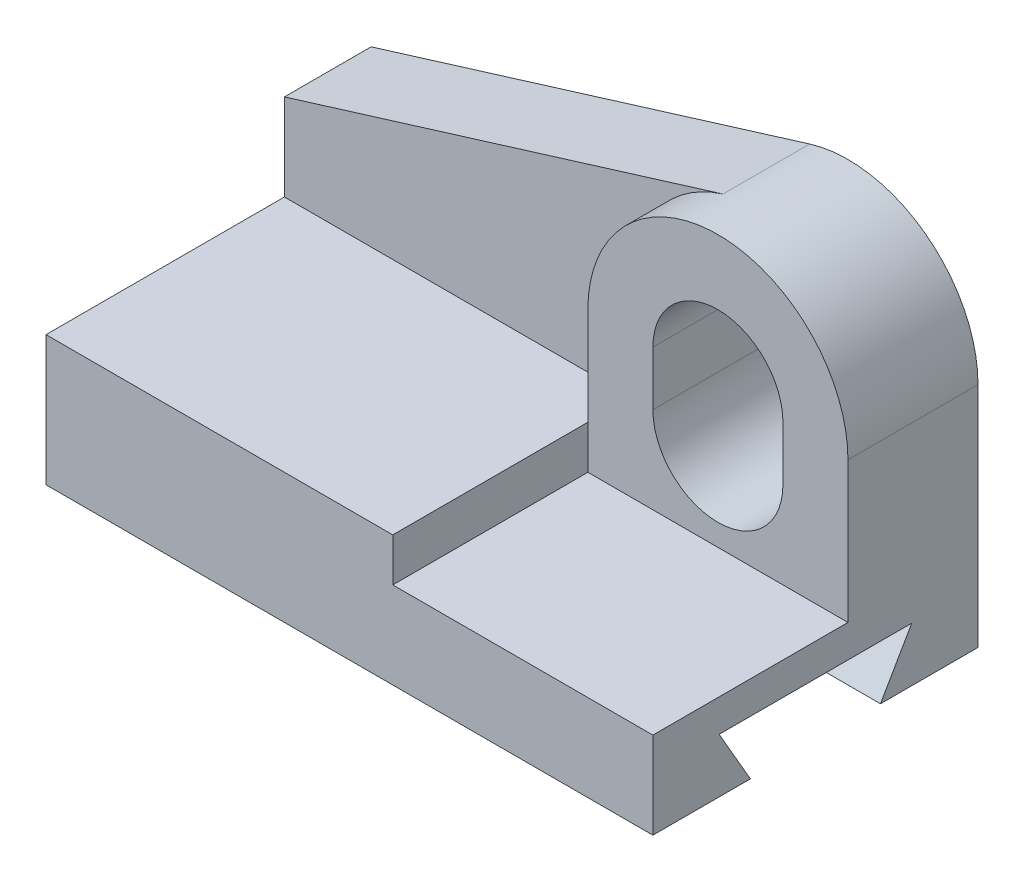
ISO-10303-21;
HEADER;
FILE_DESCRIPTION(('STEP AP214'),'2;1');
FILE_NAME('part.step','',(''),(''),'','','');
FILE_SCHEMA(('AUTOMOTIVE_DESIGN { 1 0 10303 214 1 1 1 1 }'));
ENDSEC;
DATA;
#1=APPLICATION_CONTEXT('core data for automotive mechanical design processes');
#2=APPLICATION_PROTOCOL_DEFINITION('international standard','automotive_design',2000,#1);
#3=PRODUCT_CONTEXT('',#1,'mechanical');
#4=PRODUCT('Part','Part','',(#3));
#5=PRODUCT_RELATED_PRODUCT_CATEGORY('part','',(#4));
#6=PRODUCT_DEFINITION_FORMATION('','',#4);
#7=PRODUCT_DEFINITION_CONTEXT('part definition',#1,'design');
#8=PRODUCT_DEFINITION('design','',#6,#7);
#9=PRODUCT_DEFINITION_SHAPE('','',#8);
#10=(LENGTH_UNIT() NAMED_UNIT(*) SI_UNIT(.MILLI.,.METRE.));
#11=(NAMED_UNIT(*) PLANE_ANGLE_UNIT() SI_UNIT($,.RADIAN.));
#12=(NAMED_UNIT(*) SI_UNIT($,.STERADIAN.) SOLID_ANGLE_UNIT());
#13=UNCERTAINTY_MEASURE_WITH_UNIT(LENGTH_MEASURE(1.E-05),#10,'distance_accuracy_value','');
#14=(GEOMETRIC_REPRESENTATION_CONTEXT(3) GLOBAL_UNCERTAINTY_ASSIGNED_CONTEXT((#13)) GLOBAL_UNIT_ASSIGNED_CONTEXT((#10,
#11,#12)) REPRESENTATION_CONTEXT('',''));
#15=CARTESIAN_POINT('',(0.,0.,0.));
#16=DIRECTION('',(0.,0.,1.));
#17=DIRECTION('',(1.,0.,0.));
#18=AXIS2_PLACEMENT_3D('',#15,#16,#17);
#19=CARTESIAN_POINT('',(16.,21.,-3.));
#20=DIRECTION('',(0.,0.,-1.));
#21=DIRECTION('',(-1.,0.,0.));
#22=AXIS2_PLACEMENT_3D('',#19,#20,#21);
#23=CYLINDRICAL_SURFACE('',#22,12.);
#24=DIRECTION('',(0.,0.,-1.));
#25=VECTOR('',#24,1.);
#26=CARTESIAN_POINT('',(12.466636051299,32.4680137428423,-7.));
#27=LINE('',#26,#25);
#28=CARTESIAN_POINT('',(12.466636051299,32.4680137428423,-7.));
#29=VERTEX_POINT('',#28);
#30=CARTESIAN_POINT('',(12.466636051299,32.4680137428423,-15.));
#31=VERTEX_POINT('',#30);
#32=EDGE_CURVE('E64',#29,#31,#27,.T.);
#33=ORIENTED_EDGE('',*,*,#32,.F.);
#34=CARTESIAN_POINT('',(16.,21.,-7.));
#35=DIRECTION('',(0.,0.,-1.));
#36=DIRECTION('',(1.,0.,0.));
#37=AXIS2_PLACEMENT_3D('',#34,#35,#36);
#38=CIRCLE('',#37,12.);
#39=CARTESIAN_POINT('',(4.,21.,-7.));
#40=VERTEX_POINT('',#39);
#41=EDGE_CURVE('E176',#40,#29,#38,.T.);
#42=ORIENTED_EDGE('',*,*,#41,.F.);
#43=DIRECTION('',(0.,0.,-1.));
#44=VECTOR('',#43,1.);
#45=CARTESIAN_POINT('',(4.,21.,-3.));
#46=LINE('',#45,#44);
#47=CARTESIAN_POINT('',(4.,21.,-3.));
#48=VERTEX_POINT('',#47);
#49=EDGE_CURVE('E240',#48,#40,#46,.T.);
#50=ORIENTED_EDGE('',*,*,#49,.F.);
#51=CARTESIAN_POINT('',(16.,21.,-3.));
#52=DIRECTION('',(0.,0.,1.));
#53=DIRECTION('',(-1.,0.,0.));
#54=AXIS2_PLACEMENT_3D('',#51,#52,#53);
#55=CIRCLE('',#54,12.);
#56=CARTESIAN_POINT('',(28.,21.,-3.));
#57=VERTEX_POINT('',#56);
#58=EDGE_CURVE('E234',#57,#48,#55,.T.);
#59=ORIENTED_EDGE('',*,*,#58,.F.);
#60=DIRECTION('',(0.,0.,-1.));
#61=VECTOR('',#60,1.);
#62=CARTESIAN_POINT('',(28.,21.,-3.));
#63=LINE('',#62,#61);
#64=CARTESIAN_POINT('',(28.,21.,-15.));
#65=VERTEX_POINT('',#64);
#66=EDGE_CURVE('E244',#57,#65,#63,.T.);
#67=ORIENTED_EDGE('',*,*,#66,.T.);
#68=CARTESIAN_POINT('',(16.,21.,-15.));
#69=DIRECTION('',(0.,0.,1.));
#70=DIRECTION('',(-1.,0.,0.));
#71=AXIS2_PLACEMENT_3D('',#68,#69,#70);
#72=CIRCLE('',#71,12.);
#73=EDGE_CURVE('E228',#65,#31,#72,.T.);
#74=ORIENTED_EDGE('',*,*,#73,.T.);
#75=EDGE_LOOP('',(#33,#42,#50,#59,#67,#74));
#76=FACE_BOUND('',#75,.T.);
#77=ADVANCED_FACE('F41',(#76),#23,.T.);
#78=CARTESIAN_POINT('',(0.,8.,0.));
#79=DIRECTION('',(0.,-1.,0.));
#80=DIRECTION('',(0.,0.,-1.));
#81=AXIS2_PLACEMENT_3D('',#78,#79,#80);
#82=PLANE('',#81);
#83=DIRECTION('',(1.,0.,0.));
#84=VECTOR('',#83,1.);
#85=CARTESIAN_POINT('',(4.,8.,-3.));
#86=LINE('',#85,#84);
#87=CARTESIAN_POINT('',(4.,8.,-3.));
#88=VERTEX_POINT('',#87);
#89=CARTESIAN_POINT('',(28.,8.,-3.));
#90=VERTEX_POINT('',#89);
#91=EDGE_CURVE('E229',#88,#90,#86,.T.);
#92=ORIENTED_EDGE('',*,*,#91,.F.);
#93=DIRECTION('',(0.,0.,-1.));
#94=VECTOR('',#93,1.);
#95=CARTESIAN_POINT('',(4.,8.,15.));
#96=LINE('',#95,#94);
#97=CARTESIAN_POINT('',(4.,8.,15.));
#98=VERTEX_POINT('',#97);
#99=EDGE_CURVE('E267',#98,#88,#96,.T.);
#100=ORIENTED_EDGE('',*,*,#99,.F.);
#101=DIRECTION('',(1.,0.,0.));
#102=VECTOR('',#101,1.);
#103=CARTESIAN_POINT('',(-28.,8.,15.));
#104=LINE('',#103,#102);
#105=CARTESIAN_POINT('',(28.,8.,15.));
#106=VERTEX_POINT('',#105);
#107=EDGE_CURVE('E290',#98,#106,#104,.T.);
#108=ORIENTED_EDGE('',*,*,#107,.T.);
#109=DIRECTION('',(0.,0.,-1.));
#110=VECTOR('',#109,1.);
#111=CARTESIAN_POINT('',(28.,8.,15.));
#112=LINE('',#111,#110);
#113=EDGE_CURVE('E287',#106,#90,#112,.T.);
#114=ORIENTED_EDGE('',*,*,#113,.T.);
#115=EDGE_LOOP('',(#92,#100,#108,#114));
#116=FACE_BOUND('',#115,.T.);
#117=ADVANCED_FACE('F339',(#116),#82,.F.);
#118=CARTESIAN_POINT('',(4.,12.,15.));
#119=DIRECTION('',(-1.,0.,0.));
#120=DIRECTION('',(0.,0.,1.));
#121=AXIS2_PLACEMENT_3D('',#118,#119,#120);
#122=PLANE('',#121);
#123=DIRECTION('',(0.,-1.,0.));
#124=VECTOR('',#123,1.);
#125=CARTESIAN_POINT('',(4.,8.,-3.));
#126=LINE('',#125,#124);
#127=CARTESIAN_POINT('',(4.,12.,-3.));
#128=VERTEX_POINT('',#127);
#129=EDGE_CURVE('E236',#128,#88,#126,.T.);
#130=ORIENTED_EDGE('',*,*,#129,.F.);
#131=DIRECTION('',(0.,0.,-1.));
#132=VECTOR('',#131,1.);
#133=CARTESIAN_POINT('',(4.,12.,15.));
#134=LINE('',#133,#132);
#135=CARTESIAN_POINT('',(4.,12.,15.));
#136=VERTEX_POINT('',#135);
#137=EDGE_CURVE('E278',#136,#128,#134,.T.);
#138=ORIENTED_EDGE('',*,*,#137,.F.);
#139=DIRECTION('',(0.,-1.,0.));
#140=VECTOR('',#139,1.);
#141=CARTESIAN_POINT('',(4.,12.,15.));
#142=LINE('',#141,#140);
#143=EDGE_CURVE('E281',#136,#98,#142,.T.);
#144=ORIENTED_EDGE('',*,*,#143,.T.);
#145=ORIENTED_EDGE('',*,*,#99,.T.);
#146=EDGE_LOOP('',(#130,#138,#144,#145));
#147=FACE_BOUND('',#146,.T.);
#148=ADVANCED_FACE('F344',(#147),#122,.F.);
#149=CARTESIAN_POINT('',(0.,0.,0.));
#150=DIRECTION('',(0.,-1.,0.));
#151=DIRECTION('',(0.,0.,-1.));
#152=AXIS2_PLACEMENT_3D('',#149,#150,#151);
#153=PLANE('',#152);
#154=DIRECTION('',(-1.,0.,0.));
#155=VECTOR('',#154,1.);
#156=CARTESIAN_POINT('',(28.,0.,-6.));
#157=LINE('',#156,#155);
#158=CARTESIAN_POINT('',(28.,0.,-6.));
#159=VERTEX_POINT('',#158);
#160=CARTESIAN_POINT('',(-28.,0.,-6.));
#161=VERTEX_POINT('',#160);
#162=EDGE_CURVE('E258',#159,#161,#157,.T.);
#163=ORIENTED_EDGE('',*,*,#162,.T.);
#164=DIRECTION('',(0.,0.,1.));
#165=VECTOR('',#164,1.);
#166=CARTESIAN_POINT('',(-28.,0.,15.));
#167=LINE('',#166,#165);
#168=CARTESIAN_POINT('',(-28.,0.,-15.));
#169=VERTEX_POINT('',#168);
#170=EDGE_CURVE('E300',#169,#161,#167,.T.);
#171=ORIENTED_EDGE('',*,*,#170,.F.);
#172=DIRECTION('',(-1.,0.,0.));
#173=VECTOR('',#172,1.);
#174=CARTESIAN_POINT('',(-28.,0.,-15.));
#175=LINE('',#174,#173);
#176=CARTESIAN_POINT('',(28.,0.,-15.));
#177=VERTEX_POINT('',#176);
#178=EDGE_CURVE('E297',#177,#169,#175,.T.);
#179=ORIENTED_EDGE('',*,*,#178,.F.);
#180=DIRECTION('',(0.,0.,-1.));
#181=VECTOR('',#180,1.);
#182=CARTESIAN_POINT('',(28.,0.,15.));
#183=LINE('',#182,#181);
#184=EDGE_CURVE('E286',#159,#177,#183,.T.);
#185=ORIENTED_EDGE('',*,*,#184,.F.);
#186=EDGE_LOOP('',(#163,#171,#179,#185));
#187=FACE_BOUND('',#186,.T.);
#188=ADVANCED_FACE('F312',(#187),#153,.T.);
#189=CARTESIAN_POINT('',(28.,8.,15.));
#190=DIRECTION('',(-1.,0.,0.));
#191=DIRECTION('',(0.,0.,1.));
#192=AXIS2_PLACEMENT_3D('',#189,#190,#191);
#193=PLANE('',#192);
#194=DIRECTION('',(0.,0.,-1.));
#195=VECTOR('',#194,1.);
#196=CARTESIAN_POINT('',(28.,5.,8.88675134594816));
#197=LINE('',#196,#195);
#198=CARTESIAN_POINT('',(28.,5.,8.88675134594816));
#199=VERTEX_POINT('',#198);
#200=CARTESIAN_POINT('',(28.,5.,-8.88675134594816));
#201=VERTEX_POINT('',#200);
#202=EDGE_CURVE('E255',#199,#201,#197,.T.);
#203=ORIENTED_EDGE('',*,*,#202,.T.);
#204=DIRECTION('',(0.,-0.866025403784436,0.500000000000004));
#205=VECTOR('',#204,1.);
#206=CARTESIAN_POINT('',(28.,5.,-8.88675134594816));
#207=LINE('',#206,#205);
#208=EDGE_CURVE('E248',#201,#159,#207,.T.);
#209=ORIENTED_EDGE('',*,*,#208,.T.);
#210=ORIENTED_EDGE('',*,*,#184,.T.);
#211=DIRECTION('',(0.,-1.,0.));
#212=VECTOR('',#211,1.);
#213=CARTESIAN_POINT('',(28.,8.,-15.));
#214=LINE('',#213,#212);
#215=EDGE_CURVE('E11',#65,#177,#214,.T.);
#216=ORIENTED_EDGE('',*,*,#215,.F.);
#217=ORIENTED_EDGE('',*,*,#66,.F.);
#218=DIRECTION('',(0.,1.,0.));
#219=VECTOR('',#218,1.);
#220=CARTESIAN_POINT('',(28.,8.,-3.));
#221=LINE('',#220,#219);
#222=EDGE_CURVE('E232',#90,#57,#221,.T.);
#223=ORIENTED_EDGE('',*,*,#222,.F.);
#224=ORIENTED_EDGE('',*,*,#113,.F.);
#225=DIRECTION('',(0.,-1.,0.));
#226=VECTOR('',#225,1.);
#227=CARTESIAN_POINT('',(28.,8.,15.));
#228=LINE('',#227,#226);
#229=CARTESIAN_POINT('',(28.,0.,15.));
#230=VERTEX_POINT('',#229);
#231=EDGE_CURVE('E293',#106,#230,#228,.T.);
#232=ORIENTED_EDGE('',*,*,#231,.T.);
#233=CARTESIAN_POINT('',(28.,0.,6.));
#234=VERTEX_POINT('',#233);
#235=EDGE_CURVE('E294',#230,#234,#183,.T.);
#236=ORIENTED_EDGE('',*,*,#235,.T.);
#237=DIRECTION('',(0.,0.866025403784436,0.500000000000004));
#238=VECTOR('',#237,1.);
#239=CARTESIAN_POINT('',(28.,0.,6.));
#240=LINE('',#239,#238);
#241=EDGE_CURVE('E251',#234,#199,#240,.T.);
#242=ORIENTED_EDGE('',*,*,#241,.T.);
#243=EDGE_LOOP('',(#203,#209,#210,#216,#217,#223,#224,#232,#236,#242));
#244=FACE_BOUND('',#243,.T.);
#245=ADVANCED_FACE('F43',(#244),#193,.F.);
#246=CARTESIAN_POINT('',(-28.,8.,-15.));
#247=DIRECTION('',(0.,0.,1.));
#248=DIRECTION('',(1.,0.,0.));
#249=AXIS2_PLACEMENT_3D('',#246,#247,#248);
#250=PLANE('',#249);
#251=DIRECTION('',(0.,-1.,0.));
#252=VECTOR('',#251,1.);
#253=CARTESIAN_POINT('',(-28.,8.,-15.));
#254=LINE('',#253,#252);
#255=CARTESIAN_POINT('',(-28.,20.,-15.));
#256=VERTEX_POINT('',#255);
#257=EDGE_CURVE('E49',#256,#169,#254,.T.);
#258=ORIENTED_EDGE('',*,*,#257,.F.);
#259=DIRECTION('',(-0.955667811903527,-0.29444699572508,0.));
#260=VECTOR('',#259,1.);
#261=CARTESIAN_POINT('',(-28.,20.,-15.));
#262=LINE('',#261,#260);
#263=EDGE_CURVE('E184',#31,#256,#262,.T.);
#264=ORIENTED_EDGE('',*,*,#263,.F.);
#265=ORIENTED_EDGE('',*,*,#73,.F.);
#266=ORIENTED_EDGE('',*,*,#215,.T.);
#267=ORIENTED_EDGE('',*,*,#178,.T.);
#268=EDGE_LOOP('',(#258,#264,#265,#266,#267));
#269=FACE_BOUND('',#268,.T.);
#270=DIRECTION('',(0.,1.,0.));
#271=VECTOR('',#270,1.);
#272=CARTESIAN_POINT('',(22.,21.,-15.));
#273=LINE('',#272,#271);
#274=CARTESIAN_POINT('',(22.,16.,-15.));
#275=VERTEX_POINT('',#274);
#276=CARTESIAN_POINT('',(22.,21.,-15.));
#277=VERTEX_POINT('',#276);
#278=EDGE_CURVE('E201',#275,#277,#273,.T.);
#279=ORIENTED_EDGE('',*,*,#278,.T.);
#280=CARTESIAN_POINT('',(16.,21.,-15.));
#281=DIRECTION('',(0.,0.,1.));
#282=DIRECTION('',(-1.,0.,0.));
#283=AXIS2_PLACEMENT_3D('',#280,#281,#282);
#284=CIRCLE('',#283,6.00000000000001);
#285=CARTESIAN_POINT('',(9.99999999999999,21.,-15.));
#286=VERTEX_POINT('',#285);
#287=EDGE_CURVE('E197',#277,#286,#284,.T.);
#288=ORIENTED_EDGE('',*,*,#287,.T.);
#289=DIRECTION('',(0.,-1.,0.));
#290=VECTOR('',#289,1.);
#291=CARTESIAN_POINT('',(9.99999999999999,21.,-15.));
#292=LINE('',#291,#290);
#293=CARTESIAN_POINT('',(10.,16.,-15.));
#294=VERTEX_POINT('',#293);
#295=EDGE_CURVE('E211',#286,#294,#292,.T.);
#296=ORIENTED_EDGE('',*,*,#295,.T.);
#297=CARTESIAN_POINT('',(16.,16.,-15.));
#298=DIRECTION('',(0.,0.,1.));
#299=DIRECTION('',(1.,0.,0.));
#300=AXIS2_PLACEMENT_3D('',#297,#298,#299);
#301=CIRCLE('',#300,6.);
#302=EDGE_CURVE('E214',#294,#275,#301,.T.);
#303=ORIENTED_EDGE('',*,*,#302,.T.);
#304=EDGE_LOOP('',(#279,#288,#296,#303));
#305=FACE_BOUND('',#304,.T.);
#306=ADVANCED_FACE('F358',(#269,#305),#250,.F.);
#307=CARTESIAN_POINT('',(-28.,8.,15.));
#308=DIRECTION('',(1.,0.,0.));
#309=DIRECTION('',(0.,0.,-1.));
#310=AXIS2_PLACEMENT_3D('',#307,#308,#309);
#311=PLANE('',#310);
#312=ORIENTED_EDGE('',*,*,#170,.T.);
#313=DIRECTION('',(0.,-0.866025403784436,0.500000000000004));
#314=VECTOR('',#313,1.);
#315=CARTESIAN_POINT('',(-28.,5.,-8.88675134594816));
#316=LINE('',#315,#314);
#317=CARTESIAN_POINT('',(-28.,5.,-8.88675134594816));
#318=VERTEX_POINT('',#317);
#319=EDGE_CURVE('E247',#318,#161,#316,.T.);
#320=ORIENTED_EDGE('',*,*,#319,.F.);
#321=DIRECTION('',(0.,0.,-1.));
#322=VECTOR('',#321,1.);
#323=CARTESIAN_POINT('',(-28.,5.,8.88675134594816));
#324=LINE('',#323,#322);
#325=CARTESIAN_POINT('',(-28.,5.,8.88675134594816));
#326=VERTEX_POINT('',#325);
#327=EDGE_CURVE('E252',#326,#318,#324,.T.);
#328=ORIENTED_EDGE('',*,*,#327,.F.);
#329=DIRECTION('',(0.,0.866025403784436,0.500000000000004));
#330=VECTOR('',#329,1.);
#331=CARTESIAN_POINT('',(-28.,0.,6.));
#332=LINE('',#331,#330);
#333=CARTESIAN_POINT('',(-28.,0.,6.));
#334=VERTEX_POINT('',#333);
#335=EDGE_CURVE('E260',#334,#326,#332,.T.);
#336=ORIENTED_EDGE('',*,*,#335,.F.);
#337=CARTESIAN_POINT('',(-28.,0.,15.));
#338=VERTEX_POINT('',#337);
#339=EDGE_CURVE('E299',#334,#338,#167,.T.);
#340=ORIENTED_EDGE('',*,*,#339,.T.);
#341=DIRECTION('',(0.,-1.,0.));
#342=VECTOR('',#341,1.);
#343=CARTESIAN_POINT('',(-28.,8.,15.));
#344=LINE('',#343,#342);
#345=CARTESIAN_POINT('',(-28.,12.,15.));
#346=VERTEX_POINT('',#345);
#347=EDGE_CURVE('E305',#346,#338,#344,.T.);
#348=ORIENTED_EDGE('',*,*,#347,.F.);
#349=DIRECTION('',(0.,0.,1.));
#350=VECTOR('',#349,1.);
#351=CARTESIAN_POINT('',(-28.,12.,-15.));
#352=LINE('',#351,#350);
#353=CARTESIAN_POINT('',(-28.,12.,-7.));
#354=VERTEX_POINT('',#353);
#355=EDGE_CURVE('E191',#354,#346,#352,.T.);
#356=ORIENTED_EDGE('',*,*,#355,.F.);
#357=DIRECTION('',(0.,-1.,0.));
#358=VECTOR('',#357,1.);
#359=CARTESIAN_POINT('',(-28.,12.,-7.));
#360=LINE('',#359,#358);
#361=CARTESIAN_POINT('',(-28.,20.,-7.));
#362=VERTEX_POINT('',#361);
#363=EDGE_CURVE('E174',#362,#354,#360,.T.);
#364=ORIENTED_EDGE('',*,*,#363,.F.);
#365=DIRECTION('',(0.,0.,-1.));
#366=VECTOR('',#365,1.);
#367=CARTESIAN_POINT('',(-28.,20.,-7.));
#368=LINE('',#367,#366);
#369=EDGE_CURVE('E181',#362,#256,#368,.T.);
#370=ORIENTED_EDGE('',*,*,#369,.T.);
#371=ORIENTED_EDGE('',*,*,#257,.T.);
#372=EDGE_LOOP('',(#312,#320,#328,#336,#340,#348,#356,#364,#370,#371));
#373=FACE_BOUND('',#372,.T.);
#374=ADVANCED_FACE('F189',(#373),#311,.F.);
#375=CARTESIAN_POINT('',(-28.,8.,15.));
#376=DIRECTION('',(0.,0.,-1.));
#377=DIRECTION('',(-1.,0.,0.));
#378=AXIS2_PLACEMENT_3D('',#375,#376,#377);
#379=PLANE('',#378);
#380=DIRECTION('',(1.,0.,0.));
#381=VECTOR('',#380,1.);
#382=CARTESIAN_POINT('',(-28.,0.,15.));
#383=LINE('',#382,#381);
#384=EDGE_CURVE('E291',#338,#230,#383,.T.);
#385=ORIENTED_EDGE('',*,*,#384,.T.);
#386=ORIENTED_EDGE('',*,*,#231,.F.);
#387=ORIENTED_EDGE('',*,*,#107,.F.);
#388=ORIENTED_EDGE('',*,*,#143,.F.);
#389=DIRECTION('',(1.,0.,0.));
#390=VECTOR('',#389,1.);
#391=CARTESIAN_POINT('',(-28.,12.,15.));
#392=LINE('',#391,#390);
#393=EDGE_CURVE('E275',#346,#136,#392,.T.);
#394=ORIENTED_EDGE('',*,*,#393,.F.);
#395=ORIENTED_EDGE('',*,*,#347,.T.);
#396=EDGE_LOOP('',(#385,#386,#387,#388,#394,#395));
#397=FACE_BOUND('',#396,.T.);
#398=ADVANCED_FACE('F332',(#397),#379,.F.);
#399=DIRECTION('',(-1.,0.,0.));
#400=VECTOR('',#399,1.);
#401=CARTESIAN_POINT('',(28.,0.,6.));
#402=LINE('',#401,#400);
#403=EDGE_CURVE('E270',#234,#334,#402,.T.);
#404=ORIENTED_EDGE('',*,*,#403,.F.);
#405=ORIENTED_EDGE('',*,*,#235,.F.);
#406=ORIENTED_EDGE('',*,*,#384,.F.);
#407=ORIENTED_EDGE('',*,*,#339,.F.);
#408=EDGE_LOOP('',(#404,#405,#406,#407));
#409=FACE_BOUND('',#408,.T.);
#410=ADVANCED_FACE('F328',(#409),#153,.T.);
#411=CARTESIAN_POINT('',(0.,12.,0.));
#412=DIRECTION('',(0.,1.,0.));
#413=DIRECTION('',(0.,0.,1.));
#414=AXIS2_PLACEMENT_3D('',#411,#412,#413);
#415=PLANE('',#414);
#416=DIRECTION('',(1.,0.,0.));
#417=VECTOR('',#416,1.);
#418=CARTESIAN_POINT('',(-28.,12.,-7.));
#419=LINE('',#418,#417);
#420=CARTESIAN_POINT('',(4.,12.,-7.));
#421=VERTEX_POINT('',#420);
#422=EDGE_CURVE('E56',#354,#421,#419,.T.);
#423=ORIENTED_EDGE('',*,*,#422,.F.);
#424=ORIENTED_EDGE('',*,*,#355,.T.);
#425=ORIENTED_EDGE('',*,*,#393,.T.);
#426=ORIENTED_EDGE('',*,*,#137,.T.);
#427=EDGE_CURVE('E277',#128,#421,#134,.T.);
#428=ORIENTED_EDGE('',*,*,#427,.T.);
#429=EDGE_LOOP('',(#423,#424,#425,#426,#428));
#430=FACE_BOUND('',#429,.T.);
#431=ADVANCED_FACE('F345',(#430),#415,.T.);
#432=CARTESIAN_POINT('',(28.,5.,-8.88675134594816));
#433=DIRECTION('',(0.,-0.500000000000004,-0.866025403784436));
#434=DIRECTION('',(0.,0.866025403784437,-0.500000000000004));
#435=AXIS2_PLACEMENT_3D('',#432,#433,#434);
#436=PLANE('',#435);
#437=ORIENTED_EDGE('',*,*,#319,.T.);
#438=ORIENTED_EDGE('',*,*,#162,.F.);
#439=ORIENTED_EDGE('',*,*,#208,.F.);
#440=DIRECTION('',(-1.,0.,0.));
#441=VECTOR('',#440,1.);
#442=CARTESIAN_POINT('',(28.,5.,-8.88675134594816));
#443=LINE('',#442,#441);
#444=EDGE_CURVE('E265',#201,#318,#443,.T.);
#445=ORIENTED_EDGE('',*,*,#444,.T.);
#446=EDGE_LOOP('',(#437,#438,#439,#445));
#447=FACE_BOUND('',#446,.T.);
#448=ADVANCED_FACE('F316',(#447),#436,.F.);
#449=CARTESIAN_POINT('',(28.,5.,8.88675134594816));
#450=DIRECTION('',(0.,1.,0.));
#451=DIRECTION('',(0.,0.,1.));
#452=AXIS2_PLACEMENT_3D('',#449,#450,#451);
#453=PLANE('',#452);
#454=ORIENTED_EDGE('',*,*,#327,.T.);
#455=ORIENTED_EDGE('',*,*,#444,.F.);
#456=ORIENTED_EDGE('',*,*,#202,.F.);
#457=DIRECTION('',(-1.,0.,0.));
#458=VECTOR('',#457,1.);
#459=CARTESIAN_POINT('',(28.,5.,8.88675134594816));
#460=LINE('',#459,#458);
#461=EDGE_CURVE('E268',#199,#326,#460,.T.);
#462=ORIENTED_EDGE('',*,*,#461,.T.);
#463=EDGE_LOOP('',(#454,#455,#456,#462));
#464=FACE_BOUND('',#463,.T.);
#465=ADVANCED_FACE('F320',(#464),#453,.F.);
#466=CARTESIAN_POINT('',(28.,0.,6.));
#467=DIRECTION('',(0.,-0.500000000000004,0.866025403784436));
#468=DIRECTION('',(0.,-0.866025403784437,-0.500000000000004));
#469=AXIS2_PLACEMENT_3D('',#466,#467,#468);
#470=PLANE('',#469);
#471=ORIENTED_EDGE('',*,*,#335,.T.);
#472=ORIENTED_EDGE('',*,*,#461,.F.);
#473=ORIENTED_EDGE('',*,*,#241,.F.);
#474=ORIENTED_EDGE('',*,*,#403,.T.);
#475=EDGE_LOOP('',(#471,#472,#473,#474));
#476=FACE_BOUND('',#475,.T.);
#477=ADVANCED_FACE('F397',(#476),#470,.F.);
#478=CARTESIAN_POINT('',(16.,21.,-3.));
#479=DIRECTION('',(0.,0.,-1.));
#480=DIRECTION('',(-1.,0.,0.));
#481=AXIS2_PLACEMENT_3D('',#478,#479,#480);
#482=PLANE('',#481);
#483=ORIENTED_EDGE('',*,*,#91,.T.);
#484=ORIENTED_EDGE('',*,*,#222,.T.);
#485=ORIENTED_EDGE('',*,*,#58,.T.);
#486=EDGE_CURVE('E237',#48,#128,#126,.T.);
#487=ORIENTED_EDGE('',*,*,#486,.T.);
#488=ORIENTED_EDGE('',*,*,#129,.T.);
#489=EDGE_LOOP('',(#483,#484,#485,#487,#488));
#490=FACE_BOUND('',#489,.T.);
#491=CARTESIAN_POINT('',(16.,21.,-3.));
#492=DIRECTION('',(0.,0.,1.));
#493=DIRECTION('',(-1.,0.,0.));
#494=AXIS2_PLACEMENT_3D('',#491,#492,#493);
#495=CIRCLE('',#494,6.00000000000001);
#496=CARTESIAN_POINT('',(22.,21.,-3.));
#497=VERTEX_POINT('',#496);
#498=CARTESIAN_POINT('',(9.99999999999999,21.,-3.));
#499=VERTEX_POINT('',#498);
#500=EDGE_CURVE('E198',#497,#499,#495,.T.);
#501=ORIENTED_EDGE('',*,*,#500,.F.);
#502=DIRECTION('',(0.,1.,0.));
#503=VECTOR('',#502,1.);
#504=CARTESIAN_POINT('',(22.,21.,-3.));
#505=LINE('',#504,#503);
#506=CARTESIAN_POINT('',(22.,16.,-3.));
#507=VERTEX_POINT('',#506);
#508=EDGE_CURVE('E206',#507,#497,#505,.T.);
#509=ORIENTED_EDGE('',*,*,#508,.F.);
#510=CARTESIAN_POINT('',(16.,16.,-3.));
#511=DIRECTION('',(0.,0.,1.));
#512=DIRECTION('',(1.,0.,0.));
#513=AXIS2_PLACEMENT_3D('',#510,#511,#512);
#514=CIRCLE('',#513,6.);
#515=CARTESIAN_POINT('',(10.,16.,-3.));
#516=VERTEX_POINT('',#515);
#517=EDGE_CURVE('E203',#516,#507,#514,.T.);
#518=ORIENTED_EDGE('',*,*,#517,.F.);
#519=DIRECTION('',(0.,-1.,0.));
#520=VECTOR('',#519,1.);
#521=CARTESIAN_POINT('',(9.99999999999999,21.,-3.));
#522=LINE('',#521,#520);
#523=EDGE_CURVE('E200',#499,#516,#522,.T.);
#524=ORIENTED_EDGE('',*,*,#523,.F.);
#525=EDGE_LOOP('',(#501,#509,#518,#524));
#526=FACE_BOUND('',#525,.T.);
#527=ADVANCED_FACE('F356',(#490,#526),#482,.F.);
#528=CARTESIAN_POINT('',(4.,8.,-3.));
#529=DIRECTION('',(1.,0.,0.));
#530=DIRECTION('',(0.,0.,-1.));
#531=AXIS2_PLACEMENT_3D('',#528,#529,#530);
#532=PLANE('',#531);
#533=ORIENTED_EDGE('',*,*,#49,.T.);
#534=DIRECTION('',(0.,1.,0.));
#535=VECTOR('',#534,1.);
#536=CARTESIAN_POINT('',(4.,12.,-7.));
#537=LINE('',#536,#535);
#538=EDGE_CURVE('E348',#421,#40,#537,.T.);
#539=ORIENTED_EDGE('',*,*,#538,.F.);
#540=ORIENTED_EDGE('',*,*,#427,.F.);
#541=ORIENTED_EDGE('',*,*,#486,.F.);
#542=EDGE_LOOP('',(#533,#539,#540,#541));
#543=FACE_BOUND('',#542,.T.);
#544=ADVANCED_FACE('F351',(#543),#532,.F.);
#545=CARTESIAN_POINT('',(16.,21.,-3.));
#546=DIRECTION('',(0.,0.,-1.));
#547=DIRECTION('',(-1.,0.,0.));
#548=AXIS2_PLACEMENT_3D('',#545,#546,#547);
#549=CYLINDRICAL_SURFACE('',#548,6.00000000000001);
#550=ORIENTED_EDGE('',*,*,#287,.F.);
#551=DIRECTION('',(0.,0.,-1.));
#552=VECTOR('',#551,1.);
#553=CARTESIAN_POINT('',(22.,21.,-3.));
#554=LINE('',#553,#552);
#555=EDGE_CURVE('E208',#497,#277,#554,.T.);
#556=ORIENTED_EDGE('',*,*,#555,.F.);
#557=ORIENTED_EDGE('',*,*,#500,.T.);
#558=DIRECTION('',(0.,0.,-1.));
#559=VECTOR('',#558,1.);
#560=CARTESIAN_POINT('',(9.99999999999999,21.,-3.));
#561=LINE('',#560,#559);
#562=EDGE_CURVE('E225',#499,#286,#561,.T.);
#563=ORIENTED_EDGE('',*,*,#562,.T.);
#564=EDGE_LOOP('',(#550,#556,#557,#563));
#565=FACE_BOUND('',#564,.T.);
#566=ADVANCED_FACE('F369',(#565),#549,.F.);
#567=CARTESIAN_POINT('',(9.99999999999999,21.,-3.));
#568=DIRECTION('',(1.,0.,0.));
#569=DIRECTION('',(0.,1.,0.));
#570=AXIS2_PLACEMENT_3D('',#567,#568,#569);
#571=PLANE('',#570);
#572=ORIENTED_EDGE('',*,*,#295,.F.);
#573=ORIENTED_EDGE('',*,*,#562,.F.);
#574=ORIENTED_EDGE('',*,*,#523,.T.);
#575=DIRECTION('',(0.,0.,-1.));
#576=VECTOR('',#575,1.);
#577=CARTESIAN_POINT('',(10.,16.,-3.));
#578=LINE('',#577,#576);
#579=EDGE_CURVE('E223',#516,#294,#578,.T.);
#580=ORIENTED_EDGE('',*,*,#579,.T.);
#581=EDGE_LOOP('',(#572,#573,#574,#580));
#582=FACE_BOUND('',#581,.T.);
#583=ADVANCED_FACE('F375',(#582),#571,.T.);
#584=CARTESIAN_POINT('',(16.,16.,-3.));
#585=DIRECTION('',(0.,0.,-1.));
#586=DIRECTION('',(-1.,0.,0.));
#587=AXIS2_PLACEMENT_3D('',#584,#585,#586);
#588=CYLINDRICAL_SURFACE('',#587,6.);
#589=ORIENTED_EDGE('',*,*,#302,.F.);
#590=ORIENTED_EDGE('',*,*,#579,.F.);
#591=ORIENTED_EDGE('',*,*,#517,.T.);
#592=DIRECTION('',(0.,0.,-1.));
#593=VECTOR('',#592,1.);
#594=CARTESIAN_POINT('',(22.,16.,-3.));
#595=LINE('',#594,#593);
#596=EDGE_CURVE('E221',#507,#275,#595,.T.);
#597=ORIENTED_EDGE('',*,*,#596,.T.);
#598=EDGE_LOOP('',(#589,#590,#591,#597));
#599=FACE_BOUND('',#598,.T.);
#600=ADVANCED_FACE('F377',(#599),#588,.F.);
#601=CARTESIAN_POINT('',(22.,21.,-3.));
#602=DIRECTION('',(-1.,0.,0.));
#603=DIRECTION('',(0.,-1.,0.));
#604=AXIS2_PLACEMENT_3D('',#601,#602,#603);
#605=PLANE('',#604);
#606=ORIENTED_EDGE('',*,*,#278,.F.);
#607=ORIENTED_EDGE('',*,*,#596,.F.);
#608=ORIENTED_EDGE('',*,*,#508,.T.);
#609=ORIENTED_EDGE('',*,*,#555,.T.);
#610=EDGE_LOOP('',(#606,#607,#608,#609));
#611=FACE_BOUND('',#610,.T.);
#612=ADVANCED_FACE('F364',(#611),#605,.T.);
#613=CARTESIAN_POINT('',(-28.,20.,-7.));
#614=DIRECTION('',(0.29444699572508,-0.955667811903527,0.));
#615=DIRECTION('',(0.955667811903527,0.29444699572508,0.));
#616=AXIS2_PLACEMENT_3D('',#613,#614,#615);
#617=PLANE('',#616);
#618=ORIENTED_EDGE('',*,*,#263,.T.);
#619=ORIENTED_EDGE('',*,*,#369,.F.);
#620=DIRECTION('',(-0.955667811903527,-0.29444699572508,0.));
#621=VECTOR('',#620,1.);
#622=CARTESIAN_POINT('',(-28.,20.,-7.));
#623=LINE('',#622,#621);
#624=EDGE_CURVE('E170',#29,#362,#623,.T.);
#625=ORIENTED_EDGE('',*,*,#624,.F.);
#626=ORIENTED_EDGE('',*,*,#32,.T.);
#627=EDGE_LOOP('',(#618,#619,#625,#626));
#628=FACE_BOUND('',#627,.T.);
#629=ADVANCED_FACE('F182',(#628),#617,.F.);
#630=CARTESIAN_POINT('',(16.,21.,-7.));
#631=DIRECTION('',(0.,0.,1.));
#632=DIRECTION('',(1.,0.,0.));
#633=AXIS2_PLACEMENT_3D('',#630,#631,#632);
#634=PLANE('',#633);
#635=ORIENTED_EDGE('',*,*,#422,.T.);
#636=ORIENTED_EDGE('',*,*,#538,.T.);
#637=ORIENTED_EDGE('',*,*,#41,.T.);
#638=ORIENTED_EDGE('',*,*,#624,.T.);
#639=ORIENTED_EDGE('',*,*,#363,.T.);
#640=EDGE_LOOP('',(#635,#636,#637,#638,#639));
#641=FACE_BOUND('',#640,.T.);
#642=ADVANCED_FACE('F172',(#641),#634,.T.);
#643=CLOSED_SHELL('',(#77,#117,#148,#188,#245,#306,#374,#398,#410,#431,#448,#465,#477,#527,#544,
#566,#583,#600,#612,#629,#642));
#644=MANIFOLD_SOLID_BREP('B2',#643);
#645=ADVANCED_BREP_SHAPE_REPRESENTATION('',(#18,#644),#14);
#646=SHAPE_DEFINITION_REPRESENTATION(#9,#645);
ENDSEC;
END-ISO-10303-21;
